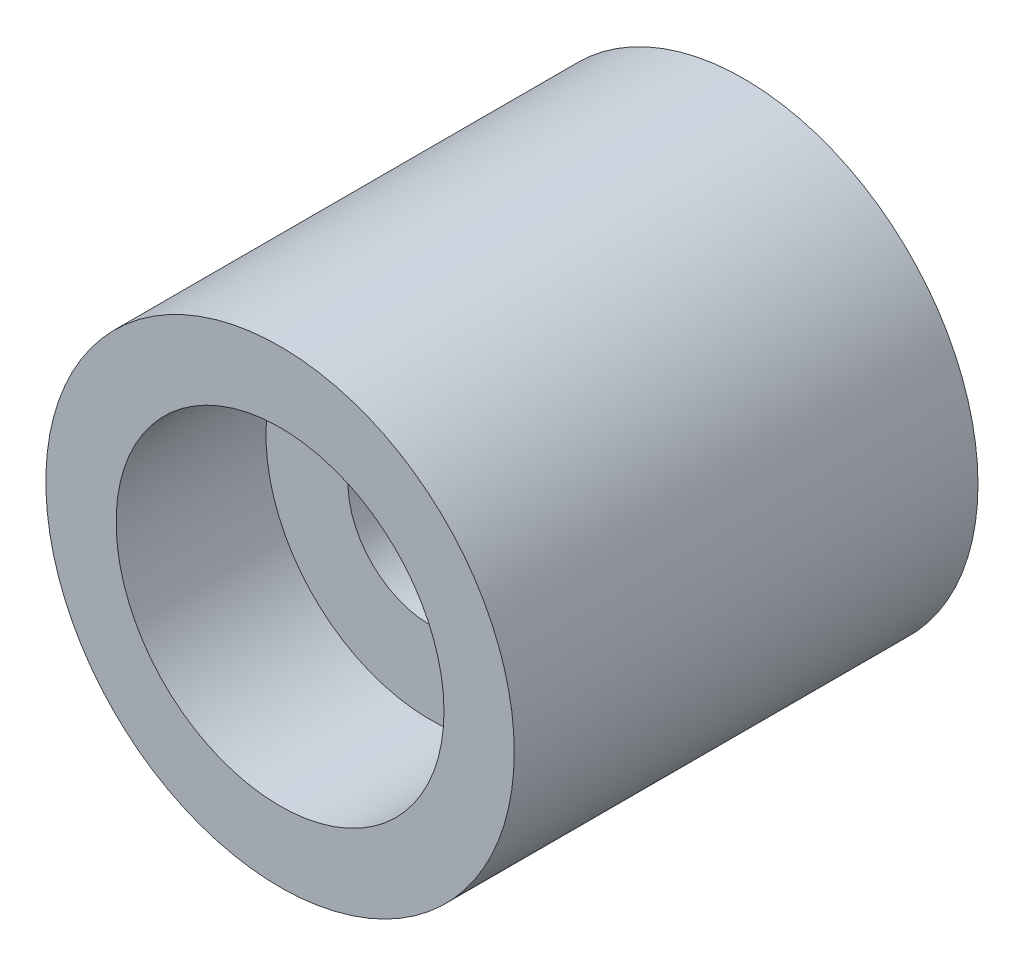
ISO-10303-21;
HEADER;
FILE_DESCRIPTION(('STEP AP214'),'2;1');
FILE_NAME('part.step','',(''),(''),'','','');
FILE_SCHEMA(('AUTOMOTIVE_DESIGN { 1 0 10303 214 1 1 1 1 }'));
ENDSEC;
DATA;
#1=APPLICATION_CONTEXT('core data for automotive mechanical design processes');
#2=APPLICATION_PROTOCOL_DEFINITION('international standard','automotive_design',2000,#1);
#3=PRODUCT_CONTEXT('',#1,'mechanical');
#4=PRODUCT('Part','Part','',(#3));
#5=PRODUCT_RELATED_PRODUCT_CATEGORY('part','',(#4));
#6=PRODUCT_DEFINITION_FORMATION('','',#4);
#7=PRODUCT_DEFINITION_CONTEXT('part definition',#1,'design');
#8=PRODUCT_DEFINITION('design','',#6,#7);
#9=PRODUCT_DEFINITION_SHAPE('','',#8);
#10=(LENGTH_UNIT() NAMED_UNIT(*) SI_UNIT(.MILLI.,.METRE.));
#11=(NAMED_UNIT(*) PLANE_ANGLE_UNIT() SI_UNIT($,.RADIAN.));
#12=(NAMED_UNIT(*) SI_UNIT($,.STERADIAN.) SOLID_ANGLE_UNIT());
#13=UNCERTAINTY_MEASURE_WITH_UNIT(LENGTH_MEASURE(1.E-05),#10,'distance_accuracy_value','');
#14=(GEOMETRIC_REPRESENTATION_CONTEXT(3) GLOBAL_UNCERTAINTY_ASSIGNED_CONTEXT((#13)) GLOBAL_UNIT_ASSIGNED_CONTEXT((#10,
#11,#12)) REPRESENTATION_CONTEXT('',''));
#15=CARTESIAN_POINT('',(0.,0.,0.));
#16=DIRECTION('',(0.,0.,1.));
#17=DIRECTION('',(1.,0.,0.));
#18=AXIS2_PLACEMENT_3D('',#15,#16,#17);
#19=CARTESIAN_POINT('',(-1.75,0.,-1.75));
#20=DIRECTION('',(0.,0.,1.));
#21=DIRECTION('',(1.,0.,0.));
#22=AXIS2_PLACEMENT_3D('',#19,#20,#21);
#23=PLANE('',#22);
#24=CARTESIAN_POINT('',(0.,0.,-1.75));
#25=DIRECTION('',(0.,0.,1.));
#26=DIRECTION('',(1.,0.,0.));
#27=AXIS2_PLACEMENT_3D('',#24,#25,#26);
#28=CIRCLE('',#27,3.5);
#29=CARTESIAN_POINT('',(3.5,0.,-1.75));
#30=VERTEX_POINT('',#29);
#31=EDGE_CURVE('E65',#30,#30,#28,.T.);
#32=ORIENTED_EDGE('',*,*,#31,.F.);
#33=EDGE_LOOP('',(#32));
#34=FACE_BOUND('',#33,.T.);
#35=CARTESIAN_POINT('',(0.,0.,-1.75));
#36=DIRECTION('',(0.,0.,1.));
#37=DIRECTION('',(1.,0.,0.));
#38=AXIS2_PLACEMENT_3D('',#35,#36,#37);
#39=CIRCLE('',#38,1.75);
#40=CARTESIAN_POINT('',(1.75,0.,-1.75));
#41=VERTEX_POINT('',#40);
#42=EDGE_CURVE('E10',#41,#41,#39,.T.);
#43=ORIENTED_EDGE('',*,*,#42,.T.);
#44=EDGE_LOOP('',(#43));
#45=FACE_BOUND('',#44,.T.);
#46=ADVANCED_FACE('F37',(#34,#45),#23,.F.);
#47=CARTESIAN_POINT('',(0.,0.,0.));
#48=DIRECTION('',(0.,0.,1.));
#49=DIRECTION('',(1.,0.,0.));
#50=AXIS2_PLACEMENT_3D('',#47,#48,#49);
#51=CYLINDRICAL_SURFACE('',#50,1.75);
#52=ORIENTED_EDGE('',*,*,#42,.F.);
#53=EDGE_LOOP('',(#52));
#54=FACE_BOUND('',#53,.T.);
#55=CARTESIAN_POINT('',(0.,0.,1.75));
#56=DIRECTION('',(0.,0.,1.));
#57=DIRECTION('',(1.,0.,0.));
#58=AXIS2_PLACEMENT_3D('',#55,#56,#57);
#59=CIRCLE('',#58,1.75);
#60=CARTESIAN_POINT('',(1.75,0.,1.75));
#61=VERTEX_POINT('',#60);
#62=EDGE_CURVE('E43',#61,#61,#59,.T.);
#63=ORIENTED_EDGE('',*,*,#62,.T.);
#64=EDGE_LOOP('',(#63));
#65=FACE_BOUND('',#64,.T.);
#66=ADVANCED_FACE('F72',(#54,#65),#51,.F.);
#67=CARTESIAN_POINT('',(-3.5,0.,1.75));
#68=DIRECTION('',(0.,0.,-1.));
#69=DIRECTION('',(-1.,0.,0.));
#70=AXIS2_PLACEMENT_3D('',#67,#68,#69);
#71=PLANE('',#70);
#72=ORIENTED_EDGE('',*,*,#62,.F.);
#73=EDGE_LOOP('',(#72));
#74=FACE_BOUND('',#73,.T.);
#75=CARTESIAN_POINT('',(0.,0.,1.75));
#76=DIRECTION('',(0.,0.,1.));
#77=DIRECTION('',(1.,0.,0.));
#78=AXIS2_PLACEMENT_3D('',#75,#76,#77);
#79=CIRCLE('',#78,3.5);
#80=CARTESIAN_POINT('',(3.5,0.,1.75));
#81=VERTEX_POINT('',#80);
#82=EDGE_CURVE('E47',#81,#81,#79,.T.);
#83=ORIENTED_EDGE('',*,*,#82,.T.);
#84=EDGE_LOOP('',(#83));
#85=FACE_BOUND('',#84,.T.);
#86=ADVANCED_FACE('F76',(#74,#85),#71,.F.);
#87=CARTESIAN_POINT('',(0.,0.,0.));
#88=DIRECTION('',(0.,0.,1.));
#89=DIRECTION('',(1.,0.,0.));
#90=AXIS2_PLACEMENT_3D('',#87,#88,#89);
#91=CYLINDRICAL_SURFACE('',#90,3.5);
#92=ORIENTED_EDGE('',*,*,#82,.F.);
#93=EDGE_LOOP('',(#92));
#94=FACE_BOUND('',#93,.T.);
#95=CARTESIAN_POINT('',(0.,0.,4.95));
#96=DIRECTION('',(0.,0.,1.));
#97=DIRECTION('',(1.,0.,0.));
#98=AXIS2_PLACEMENT_3D('',#95,#96,#97);
#99=CIRCLE('',#98,3.5);
#100=CARTESIAN_POINT('',(3.5,0.,4.95));
#101=VERTEX_POINT('',#100);
#102=EDGE_CURVE('E51',#101,#101,#99,.T.);
#103=ORIENTED_EDGE('',*,*,#102,.T.);
#104=EDGE_LOOP('',(#103));
#105=FACE_BOUND('',#104,.T.);
#106=ADVANCED_FACE('F81',(#94,#105),#91,.F.);
#107=CARTESIAN_POINT('',(-5.,0.,4.94999999999999));
#108=DIRECTION('',(0.,0.,-1.));
#109=DIRECTION('',(-1.,0.,0.));
#110=AXIS2_PLACEMENT_3D('',#107,#108,#109);
#111=PLANE('',#110);
#112=ORIENTED_EDGE('',*,*,#102,.F.);
#113=EDGE_LOOP('',(#112));
#114=FACE_BOUND('',#113,.T.);
#115=CARTESIAN_POINT('',(0.,0.,4.94999999999999));
#116=DIRECTION('',(0.,0.,1.));
#117=DIRECTION('',(1.,0.,0.));
#118=AXIS2_PLACEMENT_3D('',#115,#116,#117);
#119=CIRCLE('',#118,5.);
#120=CARTESIAN_POINT('',(5.,0.,4.94999999999999));
#121=VERTEX_POINT('',#120);
#122=EDGE_CURVE('E56',#121,#121,#119,.T.);
#123=ORIENTED_EDGE('',*,*,#122,.T.);
#124=EDGE_LOOP('',(#123));
#125=FACE_BOUND('',#124,.T.);
#126=ADVANCED_FACE('F87',(#114,#125),#111,.F.);
#127=CARTESIAN_POINT('',(0.,0.,0.));
#128=DIRECTION('',(0.,0.,1.));
#129=DIRECTION('',(1.,0.,0.));
#130=AXIS2_PLACEMENT_3D('',#127,#128,#129);
#131=CYLINDRICAL_SURFACE('',#130,5.);
#132=ORIENTED_EDGE('',*,*,#122,.F.);
#133=EDGE_LOOP('',(#132));
#134=FACE_BOUND('',#133,.T.);
#135=CARTESIAN_POINT('',(0.,0.,-4.94999999999999));
#136=DIRECTION('',(0.,0.,1.));
#137=DIRECTION('',(1.,0.,0.));
#138=AXIS2_PLACEMENT_3D('',#135,#136,#137);
#139=CIRCLE('',#138,5.);
#140=CARTESIAN_POINT('',(5.,0.,-4.94999999999999));
#141=VERTEX_POINT('',#140);
#142=EDGE_CURVE('E59',#141,#141,#139,.T.);
#143=ORIENTED_EDGE('',*,*,#142,.T.);
#144=EDGE_LOOP('',(#143));
#145=FACE_BOUND('',#144,.T.);
#146=ADVANCED_FACE('F91',(#134,#145),#131,.T.);
#147=CARTESIAN_POINT('',(-3.5,0.,-4.94999999999999));
#148=DIRECTION('',(0.,0.,1.));
#149=DIRECTION('',(1.,0.,0.));
#150=AXIS2_PLACEMENT_3D('',#147,#148,#149);
#151=PLANE('',#150);
#152=ORIENTED_EDGE('',*,*,#142,.F.);
#153=EDGE_LOOP('',(#152));
#154=FACE_BOUND('',#153,.T.);
#155=CARTESIAN_POINT('',(0.,0.,-4.95));
#156=DIRECTION('',(0.,0.,1.));
#157=DIRECTION('',(1.,0.,0.));
#158=AXIS2_PLACEMENT_3D('',#155,#156,#157);
#159=CIRCLE('',#158,3.5);
#160=CARTESIAN_POINT('',(3.5,0.,-4.95));
#161=VERTEX_POINT('',#160);
#162=EDGE_CURVE('E62',#161,#161,#159,.T.);
#163=ORIENTED_EDGE('',*,*,#162,.T.);
#164=EDGE_LOOP('',(#163));
#165=FACE_BOUND('',#164,.T.);
#166=ADVANCED_FACE('F95',(#154,#165),#151,.F.);
#167=CARTESIAN_POINT('',(0.,0.,0.));
#168=DIRECTION('',(0.,0.,1.));
#169=DIRECTION('',(1.,0.,0.));
#170=AXIS2_PLACEMENT_3D('',#167,#168,#169);
#171=CYLINDRICAL_SURFACE('',#170,3.5);
#172=ORIENTED_EDGE('',*,*,#162,.F.);
#173=EDGE_LOOP('',(#172));
#174=FACE_BOUND('',#173,.T.);
#175=ORIENTED_EDGE('',*,*,#31,.T.);
#176=EDGE_LOOP('',(#175));
#177=FACE_BOUND('',#176,.T.);
#178=ADVANCED_FACE('F69',(#174,#177),#171,.F.);
#179=CLOSED_SHELL('',(#46,#66,#86,#106,#126,#146,#166,#178));
#180=MANIFOLD_SOLID_BREP('B2',#179);
#181=ADVANCED_BREP_SHAPE_REPRESENTATION('',(#18,#180),#14);
#182=SHAPE_DEFINITION_REPRESENTATION(#9,#181);
ENDSEC;
END-ISO-10303-21;
